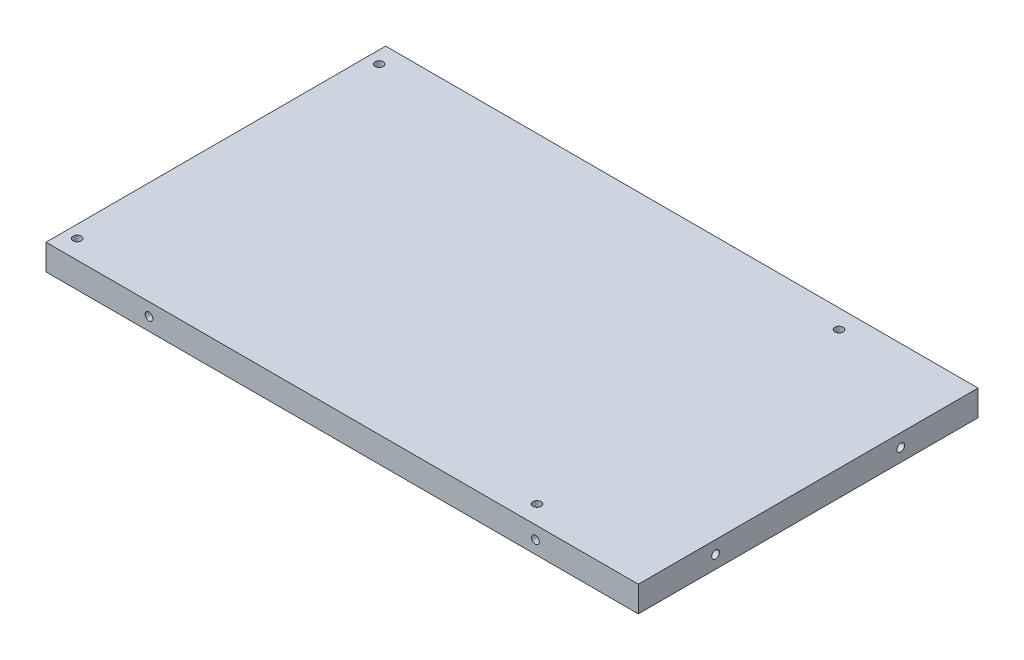
ISO-10303-21;
HEADER;
FILE_DESCRIPTION(('STEP AP214'),'2;1');
FILE_NAME('part.step','',(''),(''),'','','');
FILE_SCHEMA(('AUTOMOTIVE_DESIGN { 1 0 10303 214 1 1 1 1 }'));
ENDSEC;
DATA;
#1=APPLICATION_CONTEXT('core data for automotive mechanical design processes');
#2=APPLICATION_PROTOCOL_DEFINITION('international standard','automotive_design',2000,#1);
#3=PRODUCT_CONTEXT('',#1,'mechanical');
#4=PRODUCT('Part','Part','',(#3));
#5=PRODUCT_RELATED_PRODUCT_CATEGORY('part','',(#4));
#6=PRODUCT_DEFINITION_FORMATION('','',#4);
#7=PRODUCT_DEFINITION_CONTEXT('part definition',#1,'design');
#8=PRODUCT_DEFINITION('design','',#6,#7);
#9=PRODUCT_DEFINITION_SHAPE('','',#8);
#10=(LENGTH_UNIT() NAMED_UNIT(*) SI_UNIT(.MILLI.,.METRE.));
#11=(NAMED_UNIT(*) PLANE_ANGLE_UNIT() SI_UNIT($,.RADIAN.));
#12=(NAMED_UNIT(*) SI_UNIT($,.STERADIAN.) SOLID_ANGLE_UNIT());
#13=UNCERTAINTY_MEASURE_WITH_UNIT(LENGTH_MEASURE(1.E-05),#10,'distance_accuracy_value','');
#14=(GEOMETRIC_REPRESENTATION_CONTEXT(3) GLOBAL_UNCERTAINTY_ASSIGNED_CONTEXT((#13)) GLOBAL_UNIT_ASSIGNED_CONTEXT((#10,
#11,#12)) REPRESENTATION_CONTEXT('',''));
#15=CARTESIAN_POINT('',(0.,0.,0.));
#16=DIRECTION('',(0.,0.,1.));
#17=DIRECTION('',(1.,0.,0.));
#18=AXIS2_PLACEMENT_3D('',#15,#16,#17);
#19=CARTESIAN_POINT('',(0.,5.,0.));
#20=DIRECTION('',(0.,0.,-1.));
#21=DIRECTION('',(-1.,0.,0.));
#22=AXIS2_PLACEMENT_3D('',#19,#20,#21);
#23=PLANE('',#22);
#24=CARTESIAN_POINT('',(20.,2.5,0.));
#25=DIRECTION('',(0.,0.,-1.));
#26=DIRECTION('',(-1.,0.,0.));
#27=AXIS2_PLACEMENT_3D('',#24,#25,#26);
#28=CIRCLE('',#27,0.749999999999998);
#29=CARTESIAN_POINT('',(19.25,2.5,0.));
#30=VERTEX_POINT('',#29);
#31=EDGE_CURVE('E123',#30,#30,#28,.T.);
#32=ORIENTED_EDGE('',*,*,#31,.F.);
#33=EDGE_LOOP('',(#32));
#34=FACE_BOUND('',#33,.T.);
#35=CARTESIAN_POINT('',(95.1,2.5,0.));
#36=DIRECTION('',(0.,0.,-1.));
#37=DIRECTION('',(-1.,0.,0.));
#38=AXIS2_PLACEMENT_3D('',#35,#36,#37);
#39=CIRCLE('',#38,0.749999999999999);
#40=CARTESIAN_POINT('',(94.35,2.5,0.));
#41=VERTEX_POINT('',#40);
#42=EDGE_CURVE('E126',#41,#41,#39,.T.);
#43=ORIENTED_EDGE('',*,*,#42,.F.);
#44=EDGE_LOOP('',(#43));
#45=FACE_BOUND('',#44,.T.);
#46=DIRECTION('',(1.,0.,0.));
#47=VECTOR('',#46,1.);
#48=CARTESIAN_POINT('',(0.,0.,0.));
#49=LINE('',#48,#47);
#50=CARTESIAN_POINT('',(0.,0.,0.));
#51=VERTEX_POINT('',#50);
#52=CARTESIAN_POINT('',(115.1,0.,0.));
#53=VERTEX_POINT('',#52);
#54=EDGE_CURVE('E100',#51,#53,#49,.T.);
#55=ORIENTED_EDGE('',*,*,#54,.F.);
#56=DIRECTION('',(0.,-1.,0.));
#57=VECTOR('',#56,1.);
#58=CARTESIAN_POINT('',(0.,5.,0.));
#59=LINE('',#58,#57);
#60=CARTESIAN_POINT('',(0.,5.,0.));
#61=VERTEX_POINT('',#60);
#62=EDGE_CURVE('E11',#61,#51,#59,.T.);
#63=ORIENTED_EDGE('',*,*,#62,.F.);
#64=DIRECTION('',(1.,0.,0.));
#65=VECTOR('',#64,1.);
#66=CARTESIAN_POINT('',(0.,5.,0.));
#67=LINE('',#66,#65);
#68=CARTESIAN_POINT('',(115.1,5.,0.));
#69=VERTEX_POINT('',#68);
#70=EDGE_CURVE('E94',#61,#69,#67,.T.);
#71=ORIENTED_EDGE('',*,*,#70,.T.);
#72=DIRECTION('',(0.,-1.,0.));
#73=VECTOR('',#72,1.);
#74=CARTESIAN_POINT('',(115.1,5.,0.));
#75=LINE('',#74,#73);
#76=EDGE_CURVE('E37',#69,#53,#75,.T.);
#77=ORIENTED_EDGE('',*,*,#76,.T.);
#78=EDGE_LOOP('',(#55,#63,#71,#77));
#79=FACE_BOUND('',#78,.T.);
#80=ADVANCED_FACE('F34',(#34,#45,#79),#23,.T.);
#81=CARTESIAN_POINT('',(0.,5.,0.));
#82=DIRECTION('',(1.,0.,0.));
#83=DIRECTION('',(0.,0.,-1.));
#84=AXIS2_PLACEMENT_3D('',#81,#82,#83);
#85=PLANE('',#84);
#86=CARTESIAN_POINT('',(0.,2.5,15.));
#87=DIRECTION('',(-1.,0.,0.));
#88=DIRECTION('',(0.,0.,1.));
#89=AXIS2_PLACEMENT_3D('',#86,#87,#88);
#90=CIRCLE('',#89,0.749999999999998);
#91=CARTESIAN_POINT('',(0.,2.5,15.75));
#92=VERTEX_POINT('',#91);
#93=EDGE_CURVE('E168',#92,#92,#90,.T.);
#94=ORIENTED_EDGE('',*,*,#93,.F.);
#95=EDGE_LOOP('',(#94));
#96=FACE_BOUND('',#95,.T.);
#97=CARTESIAN_POINT('',(0.,2.5,51.));
#98=DIRECTION('',(-1.,0.,0.));
#99=DIRECTION('',(0.,0.,1.));
#100=AXIS2_PLACEMENT_3D('',#97,#98,#99);
#101=CIRCLE('',#100,0.749999999999999);
#102=CARTESIAN_POINT('',(0.,2.5,51.75));
#103=VERTEX_POINT('',#102);
#104=EDGE_CURVE('E171',#103,#103,#101,.T.);
#105=ORIENTED_EDGE('',*,*,#104,.F.);
#106=EDGE_LOOP('',(#105));
#107=FACE_BOUND('',#106,.T.);
#108=DIRECTION('',(0.,0.,1.));
#109=VECTOR('',#108,1.);
#110=CARTESIAN_POINT('',(0.,0.,0.));
#111=LINE('',#110,#109);
#112=CARTESIAN_POINT('',(0.,0.,66.));
#113=VERTEX_POINT('',#112);
#114=EDGE_CURVE('E67',#51,#113,#111,.T.);
#115=ORIENTED_EDGE('',*,*,#114,.T.);
#116=DIRECTION('',(0.,-1.,0.));
#117=VECTOR('',#116,1.);
#118=CARTESIAN_POINT('',(0.,5.,66.));
#119=LINE('',#118,#117);
#120=CARTESIAN_POINT('',(0.,5.,66.));
#121=VERTEX_POINT('',#120);
#122=EDGE_CURVE('E43',#121,#113,#119,.T.);
#123=ORIENTED_EDGE('',*,*,#122,.F.);
#124=DIRECTION('',(0.,0.,1.));
#125=VECTOR('',#124,1.);
#126=CARTESIAN_POINT('',(0.,5.,0.));
#127=LINE('',#126,#125);
#128=EDGE_CURVE('E84',#61,#121,#127,.T.);
#129=ORIENTED_EDGE('',*,*,#128,.F.);
#130=ORIENTED_EDGE('',*,*,#62,.T.);
#131=EDGE_LOOP('',(#115,#123,#129,#130));
#132=FACE_BOUND('',#131,.T.);
#133=ADVANCED_FACE('F111',(#96,#107,#132),#85,.F.);
#134=CARTESIAN_POINT('',(0.,5.,66.));
#135=DIRECTION('',(0.,0.,-1.));
#136=DIRECTION('',(-1.,0.,0.));
#137=AXIS2_PLACEMENT_3D('',#134,#135,#136);
#138=PLANE('',#137);
#139=CARTESIAN_POINT('',(20.,2.5,66.));
#140=DIRECTION('',(0.,0.,1.));
#141=DIRECTION('',(1.,0.,0.));
#142=AXIS2_PLACEMENT_3D('',#139,#140,#141);
#143=CIRCLE('',#142,0.749999999999998);
#144=CARTESIAN_POINT('',(20.75,2.5,66.));
#145=VERTEX_POINT('',#144);
#146=EDGE_CURVE('E142',#145,#145,#143,.T.);
#147=ORIENTED_EDGE('',*,*,#146,.F.);
#148=EDGE_LOOP('',(#147));
#149=FACE_BOUND('',#148,.T.);
#150=CARTESIAN_POINT('',(95.1,2.5,66.));
#151=DIRECTION('',(0.,0.,1.));
#152=DIRECTION('',(1.,0.,0.));
#153=AXIS2_PLACEMENT_3D('',#150,#151,#152);
#154=CIRCLE('',#153,0.749999999999999);
#155=CARTESIAN_POINT('',(95.85,2.5,66.));
#156=VERTEX_POINT('',#155);
#157=EDGE_CURVE('E148',#156,#156,#154,.T.);
#158=ORIENTED_EDGE('',*,*,#157,.F.);
#159=EDGE_LOOP('',(#158));
#160=FACE_BOUND('',#159,.T.);
#161=DIRECTION('',(1.,0.,0.));
#162=VECTOR('',#161,1.);
#163=CARTESIAN_POINT('',(0.,0.,66.));
#164=LINE('',#163,#162);
#165=CARTESIAN_POINT('',(115.1,0.,66.));
#166=VERTEX_POINT('',#165);
#167=EDGE_CURVE('E91',#113,#166,#164,.T.);
#168=ORIENTED_EDGE('',*,*,#167,.T.);
#169=DIRECTION('',(0.,-1.,0.));
#170=VECTOR('',#169,1.);
#171=CARTESIAN_POINT('',(115.1,5.,66.));
#172=LINE('',#171,#170);
#173=CARTESIAN_POINT('',(115.1,5.,66.));
#174=VERTEX_POINT('',#173);
#175=EDGE_CURVE('E88',#174,#166,#172,.T.);
#176=ORIENTED_EDGE('',*,*,#175,.F.);
#177=DIRECTION('',(1.,0.,0.));
#178=VECTOR('',#177,1.);
#179=CARTESIAN_POINT('',(0.,5.,66.));
#180=LINE('',#179,#178);
#181=EDGE_CURVE('E79',#121,#174,#180,.T.);
#182=ORIENTED_EDGE('',*,*,#181,.F.);
#183=ORIENTED_EDGE('',*,*,#122,.T.);
#184=EDGE_LOOP('',(#168,#176,#182,#183));
#185=FACE_BOUND('',#184,.T.);
#186=ADVANCED_FACE('F89',(#149,#160,#185),#138,.F.);
#187=CARTESIAN_POINT('',(115.1,5.,0.));
#188=DIRECTION('',(1.,0.,0.));
#189=DIRECTION('',(0.,0.,-1.));
#190=AXIS2_PLACEMENT_3D('',#187,#188,#189);
#191=PLANE('',#190);
#192=CARTESIAN_POINT('',(115.1,2.5,51.));
#193=DIRECTION('',(1.,0.,0.));
#194=DIRECTION('',(0.,0.,-1.));
#195=AXIS2_PLACEMENT_3D('',#192,#193,#194);
#196=CIRCLE('',#195,0.749999999999999);
#197=CARTESIAN_POINT('',(115.1,2.5,50.25));
#198=VERTEX_POINT('',#197);
#199=EDGE_CURVE('E156',#198,#198,#196,.T.);
#200=ORIENTED_EDGE('',*,*,#199,.F.);
#201=EDGE_LOOP('',(#200));
#202=FACE_BOUND('',#201,.T.);
#203=CARTESIAN_POINT('',(115.1,2.5,15.));
#204=DIRECTION('',(1.,0.,0.));
#205=DIRECTION('',(0.,0.,-1.));
#206=AXIS2_PLACEMENT_3D('',#203,#204,#205);
#207=CIRCLE('',#206,0.749999999999998);
#208=CARTESIAN_POINT('',(115.1,2.5,14.25));
#209=VERTEX_POINT('',#208);
#210=EDGE_CURVE('E141',#209,#209,#207,.T.);
#211=ORIENTED_EDGE('',*,*,#210,.F.);
#212=EDGE_LOOP('',(#211));
#213=FACE_BOUND('',#212,.T.);
#214=DIRECTION('',(0.,0.,1.));
#215=VECTOR('',#214,1.);
#216=CARTESIAN_POINT('',(115.1,0.,0.));
#217=LINE('',#216,#215);
#218=EDGE_CURVE('E103',#53,#166,#217,.T.);
#219=ORIENTED_EDGE('',*,*,#218,.F.);
#220=ORIENTED_EDGE('',*,*,#76,.F.);
#221=DIRECTION('',(0.,0.,1.));
#222=VECTOR('',#221,1.);
#223=CARTESIAN_POINT('',(115.1,5.,0.));
#224=LINE('',#223,#222);
#225=EDGE_CURVE('E83',#69,#174,#224,.T.);
#226=ORIENTED_EDGE('',*,*,#225,.T.);
#227=ORIENTED_EDGE('',*,*,#175,.T.);
#228=EDGE_LOOP('',(#219,#220,#226,#227));
#229=FACE_BOUND('',#228,.T.);
#230=ADVANCED_FACE('F93',(#202,#213,#229),#191,.T.);
#231=CARTESIAN_POINT('',(0.,5.,0.));
#232=DIRECTION('',(0.,-1.,0.));
#233=DIRECTION('',(0.,0.,-1.));
#234=AXIS2_PLACEMENT_3D('',#231,#232,#233);
#235=PLANE('',#234);
#236=CARTESIAN_POINT('',(91.7499999999988,5.,3.65647481694185));
#237=DIRECTION('',(0.,1.,0.));
#238=DIRECTION('',(0.,0.,1.));
#239=AXIS2_PLACEMENT_3D('',#236,#237,#238);
#240=CIRCLE('',#239,0.799999999999995);
#241=CARTESIAN_POINT('',(91.7499999999988,5.,4.45647481694184));
#242=VERTEX_POINT('',#241);
#243=EDGE_CURVE('E182',#242,#242,#240,.T.);
#244=ORIENTED_EDGE('',*,*,#243,.F.);
#245=EDGE_LOOP('',(#244));
#246=FACE_BOUND('',#245,.T.);
#247=CARTESIAN_POINT('',(2.39999999999885,5.,62.3499962310792));
#248=DIRECTION('',(0.,1.,0.));
#249=DIRECTION('',(0.,0.,1.));
#250=AXIS2_PLACEMENT_3D('',#247,#248,#249);
#251=CIRCLE('',#250,0.800000000000005);
#252=CARTESIAN_POINT('',(2.39999999999885,5.,63.1499962310792));
#253=VERTEX_POINT('',#252);
#254=EDGE_CURVE('E189',#253,#253,#251,.T.);
#255=ORIENTED_EDGE('',*,*,#254,.F.);
#256=EDGE_LOOP('',(#255));
#257=FACE_BOUND('',#256,.T.);
#258=CARTESIAN_POINT('',(2.39999999999885,5.,3.65647481694185));
#259=DIRECTION('',(0.,1.,0.));
#260=DIRECTION('',(0.,0.,1.));
#261=AXIS2_PLACEMENT_3D('',#258,#259,#260);
#262=CIRCLE('',#261,0.799999999999999);
#263=CARTESIAN_POINT('',(2.39999999999885,5.,4.45647481694185));
#264=VERTEX_POINT('',#263);
#265=EDGE_CURVE('E176',#264,#264,#262,.T.);
#266=ORIENTED_EDGE('',*,*,#265,.F.);
#267=EDGE_LOOP('',(#266));
#268=FACE_BOUND('',#267,.T.);
#269=CARTESIAN_POINT('',(91.7499999999988,5.,62.3499962310792));
#270=DIRECTION('',(0.,1.,0.));
#271=DIRECTION('',(0.,0.,1.));
#272=AXIS2_PLACEMENT_3D('',#269,#270,#271);
#273=CIRCLE('',#272,0.80000000000001);
#274=CARTESIAN_POINT('',(91.7499999999988,5.,63.1499962310792));
#275=VERTEX_POINT('',#274);
#276=EDGE_CURVE('E185',#275,#275,#273,.T.);
#277=ORIENTED_EDGE('',*,*,#276,.F.);
#278=EDGE_LOOP('',(#277));
#279=FACE_BOUND('',#278,.T.);
#280=ORIENTED_EDGE('',*,*,#70,.F.);
#281=ORIENTED_EDGE('',*,*,#128,.T.);
#282=ORIENTED_EDGE('',*,*,#181,.T.);
#283=ORIENTED_EDGE('',*,*,#225,.F.);
#284=EDGE_LOOP('',(#280,#281,#282,#283));
#285=FACE_BOUND('',#284,.T.);
#286=ADVANCED_FACE('F82',(#246,#257,#268,#279,#285),#235,.F.);
#287=CARTESIAN_POINT('',(0.,0.,0.));
#288=DIRECTION('',(0.,-1.,0.));
#289=DIRECTION('',(0.,0.,-1.));
#290=AXIS2_PLACEMENT_3D('',#287,#288,#289);
#291=PLANE('',#290);
#292=CARTESIAN_POINT('',(72.6,0.,8.8));
#293=DIRECTION('',(0.,-1.,0.));
#294=DIRECTION('',(0.,0.,-1.));
#295=AXIS2_PLACEMENT_3D('',#292,#293,#294);
#296=CIRCLE('',#295,0.749999999999999);
#297=CARTESIAN_POINT('',(72.6,0.,8.05));
#298=VERTEX_POINT('',#297);
#299=EDGE_CURVE('E584',#298,#298,#296,.T.);
#300=ORIENTED_EDGE('',*,*,#299,.F.);
#301=EDGE_LOOP('',(#300));
#302=FACE_BOUND('',#301,.T.);
#303=CARTESIAN_POINT('',(42.5,0.,8.8));
#304=DIRECTION('',(0.,-1.,0.));
#305=DIRECTION('',(0.,0.,-1.));
#306=AXIS2_PLACEMENT_3D('',#303,#304,#305);
#307=CIRCLE('',#306,0.749999999999999);
#308=CARTESIAN_POINT('',(42.5,0.,8.05));
#309=VERTEX_POINT('',#308);
#310=EDGE_CURVE('E590',#309,#309,#307,.T.);
#311=ORIENTED_EDGE('',*,*,#310,.F.);
#312=EDGE_LOOP('',(#311));
#313=FACE_BOUND('',#312,.T.);
#314=CARTESIAN_POINT('',(42.5,0.,57.2));
#315=DIRECTION('',(0.,-1.,0.));
#316=DIRECTION('',(0.,0.,-1.));
#317=AXIS2_PLACEMENT_3D('',#314,#315,#316);
#318=CIRCLE('',#317,0.749999999999999);
#319=CARTESIAN_POINT('',(42.5,0.,56.45));
#320=VERTEX_POINT('',#319);
#321=EDGE_CURVE('E580',#320,#320,#318,.T.);
#322=ORIENTED_EDGE('',*,*,#321,.F.);
#323=EDGE_LOOP('',(#322));
#324=FACE_BOUND('',#323,.T.);
#325=CARTESIAN_POINT('',(72.6,0.,57.2));
#326=DIRECTION('',(0.,-1.,0.));
#327=DIRECTION('',(0.,0.,-1.));
#328=AXIS2_PLACEMENT_3D('',#325,#326,#327);
#329=CIRCLE('',#328,0.749999999999999);
#330=CARTESIAN_POINT('',(72.6,0.,56.45));
#331=VERTEX_POINT('',#330);
#332=EDGE_CURVE('E134',#331,#331,#329,.T.);
#333=ORIENTED_EDGE('',*,*,#332,.F.);
#334=EDGE_LOOP('',(#333));
#335=FACE_BOUND('',#334,.T.);
#336=ORIENTED_EDGE('',*,*,#54,.T.);
#337=ORIENTED_EDGE('',*,*,#218,.T.);
#338=ORIENTED_EDGE('',*,*,#167,.F.);
#339=ORIENTED_EDGE('',*,*,#114,.F.);
#340=EDGE_LOOP('',(#336,#337,#338,#339));
#341=FACE_BOUND('',#340,.T.);
#342=ADVANCED_FACE('F109',(#302,#313,#324,#335,#341),#291,.T.);
#343=CARTESIAN_POINT('',(91.7499999999988,2.,62.3499962310792));
#344=DIRECTION('',(0.,1.,0.));
#345=DIRECTION('',(0.,0.,1.));
#346=AXIS2_PLACEMENT_3D('',#343,#344,#345);
#347=CYLINDRICAL_SURFACE('',#346,0.80000000000001);
#348=CARTESIAN_POINT('',(91.7499999999988,2.,62.3499962310792));
#349=DIRECTION('',(0.,1.,0.));
#350=DIRECTION('',(0.,0.,1.));
#351=AXIS2_PLACEMENT_3D('',#348,#349,#350);
#352=CIRCLE('',#351,0.80000000000001);
#353=CARTESIAN_POINT('',(91.7499999999988,2.,63.1499962310792));
#354=VERTEX_POINT('',#353);
#355=EDGE_CURVE('E104',#354,#354,#352,.T.);
#356=ORIENTED_EDGE('',*,*,#355,.F.);
#357=EDGE_LOOP('',(#356));
#358=FACE_BOUND('',#357,.T.);
#359=ORIENTED_EDGE('',*,*,#276,.T.);
#360=EDGE_LOOP('',(#359));
#361=FACE_BOUND('',#360,.T.);
#362=ADVANCED_FACE('F198',(#358,#361),#347,.F.);
#363=CARTESIAN_POINT('',(91.7499999999988,2.,62.3499962310792));
#364=DIRECTION('',(0.,1.,0.));
#365=DIRECTION('',(0.,0.,1.));
#366=AXIS2_PLACEMENT_3D('',#363,#364,#365);
#367=PLANE('',#366);
#368=ORIENTED_EDGE('',*,*,#355,.T.);
#369=EDGE_LOOP('',(#368));
#370=FACE_BOUND('',#369,.T.);
#371=ADVANCED_FACE('F277',(#370),#367,.T.);
#372=CARTESIAN_POINT('',(2.39999999999885,2.,3.65647481694185));
#373=DIRECTION('',(0.,1.,0.));
#374=DIRECTION('',(0.,0.,1.));
#375=AXIS2_PLACEMENT_3D('',#372,#373,#374);
#376=CYLINDRICAL_SURFACE('',#375,0.799999999999999);
#377=CARTESIAN_POINT('',(2.39999999999885,2.,3.65647481694185));
#378=DIRECTION('',(0.,1.,0.));
#379=DIRECTION('',(0.,0.,1.));
#380=AXIS2_PLACEMENT_3D('',#377,#378,#379);
#381=CIRCLE('',#380,0.799999999999999);
#382=CARTESIAN_POINT('',(2.39999999999885,2.,4.45647481694185));
#383=VERTEX_POINT('',#382);
#384=EDGE_CURVE('E167',#383,#383,#381,.T.);
#385=ORIENTED_EDGE('',*,*,#384,.F.);
#386=EDGE_LOOP('',(#385));
#387=FACE_BOUND('',#386,.T.);
#388=ORIENTED_EDGE('',*,*,#265,.T.);
#389=EDGE_LOOP('',(#388));
#390=FACE_BOUND('',#389,.T.);
#391=ADVANCED_FACE('F273',(#387,#390),#376,.F.);
#392=CARTESIAN_POINT('',(2.39999999999885,2.,3.65647481694185));
#393=DIRECTION('',(0.,1.,0.));
#394=DIRECTION('',(0.,0.,1.));
#395=AXIS2_PLACEMENT_3D('',#392,#393,#394);
#396=PLANE('',#395);
#397=ORIENTED_EDGE('',*,*,#384,.T.);
#398=EDGE_LOOP('',(#397));
#399=FACE_BOUND('',#398,.T.);
#400=ADVANCED_FACE('F276',(#399),#396,.T.);
#401=CARTESIAN_POINT('',(2.39999999999885,2.,62.3499962310792));
#402=DIRECTION('',(0.,1.,0.));
#403=DIRECTION('',(0.,0.,1.));
#404=AXIS2_PLACEMENT_3D('',#401,#402,#403);
#405=CYLINDRICAL_SURFACE('',#404,0.800000000000005);
#406=CARTESIAN_POINT('',(2.39999999999885,2.,62.3499962310792));
#407=DIRECTION('',(0.,1.,0.));
#408=DIRECTION('',(0.,0.,1.));
#409=AXIS2_PLACEMENT_3D('',#406,#407,#408);
#410=CIRCLE('',#409,0.800000000000005);
#411=CARTESIAN_POINT('',(2.39999999999885,2.,63.1499962310792));
#412=VERTEX_POINT('',#411);
#413=EDGE_CURVE('E179',#412,#412,#410,.T.);
#414=ORIENTED_EDGE('',*,*,#413,.F.);
#415=EDGE_LOOP('',(#414));
#416=FACE_BOUND('',#415,.T.);
#417=ORIENTED_EDGE('',*,*,#254,.T.);
#418=EDGE_LOOP('',(#417));
#419=FACE_BOUND('',#418,.T.);
#420=ADVANCED_FACE('F281',(#416,#419),#405,.F.);
#421=CARTESIAN_POINT('',(2.39999999999885,2.,62.3499962310792));
#422=DIRECTION('',(0.,1.,0.));
#423=DIRECTION('',(0.,0.,1.));
#424=AXIS2_PLACEMENT_3D('',#421,#422,#423);
#425=PLANE('',#424);
#426=ORIENTED_EDGE('',*,*,#413,.T.);
#427=EDGE_LOOP('',(#426));
#428=FACE_BOUND('',#427,.T.);
#429=ADVANCED_FACE('F286',(#428),#425,.T.);
#430=CARTESIAN_POINT('',(91.7499999999988,2.,3.65647481694185));
#431=DIRECTION('',(0.,1.,0.));
#432=DIRECTION('',(0.,0.,1.));
#433=AXIS2_PLACEMENT_3D('',#430,#431,#432);
#434=CYLINDRICAL_SURFACE('',#433,0.799999999999995);
#435=CARTESIAN_POINT('',(91.7499999999988,2.,3.65647481694185));
#436=DIRECTION('',(0.,1.,0.));
#437=DIRECTION('',(0.,0.,1.));
#438=AXIS2_PLACEMENT_3D('',#435,#436,#437);
#439=CIRCLE('',#438,0.799999999999995);
#440=CARTESIAN_POINT('',(91.7499999999988,2.,4.45647481694184));
#441=VERTEX_POINT('',#440);
#442=EDGE_CURVE('E186',#441,#441,#439,.T.);
#443=ORIENTED_EDGE('',*,*,#442,.F.);
#444=EDGE_LOOP('',(#443));
#445=FACE_BOUND('',#444,.T.);
#446=ORIENTED_EDGE('',*,*,#243,.T.);
#447=EDGE_LOOP('',(#446));
#448=FACE_BOUND('',#447,.T.);
#449=ADVANCED_FACE('F283',(#445,#448),#434,.F.);
#450=CARTESIAN_POINT('',(91.7499999999988,2.,3.65647481694185));
#451=DIRECTION('',(0.,1.,0.));
#452=DIRECTION('',(0.,0.,1.));
#453=AXIS2_PLACEMENT_3D('',#450,#451,#452);
#454=PLANE('',#453);
#455=ORIENTED_EDGE('',*,*,#442,.T.);
#456=EDGE_LOOP('',(#455));
#457=FACE_BOUND('',#456,.T.);
#458=ADVANCED_FACE('F268',(#457),#454,.T.);
#459=CARTESIAN_POINT('',(3.99999999999999,2.5,51.));
#460=DIRECTION('',(-1.,0.,0.));
#461=DIRECTION('',(0.,0.,1.));
#462=AXIS2_PLACEMENT_3D('',#459,#460,#461);
#463=CYLINDRICAL_SURFACE('',#462,0.749999999999999);
#464=CARTESIAN_POINT('',(3.99999999999999,2.5,51.));
#465=DIRECTION('',(-1.,0.,0.));
#466=DIRECTION('',(0.,0.,1.));
#467=AXIS2_PLACEMENT_3D('',#464,#465,#466);
#468=CIRCLE('',#467,0.749999999999999);
#469=CARTESIAN_POINT('',(3.99999999999999,2.5,51.75));
#470=VERTEX_POINT('',#469);
#471=EDGE_CURVE('E155',#470,#470,#468,.T.);
#472=ORIENTED_EDGE('',*,*,#471,.F.);
#473=EDGE_LOOP('',(#472));
#474=FACE_BOUND('',#473,.T.);
#475=ORIENTED_EDGE('',*,*,#104,.T.);
#476=EDGE_LOOP('',(#475));
#477=FACE_BOUND('',#476,.T.);
#478=ADVANCED_FACE('F265',(#474,#477),#463,.F.);
#479=CARTESIAN_POINT('',(3.99999999999999,2.5,51.));
#480=DIRECTION('',(-1.,0.,0.));
#481=DIRECTION('',(0.,0.,1.));
#482=AXIS2_PLACEMENT_3D('',#479,#480,#481);
#483=PLANE('',#482);
#484=ORIENTED_EDGE('',*,*,#471,.T.);
#485=EDGE_LOOP('',(#484));
#486=FACE_BOUND('',#485,.T.);
#487=ADVANCED_FACE('F263',(#486),#483,.T.);
#488=CARTESIAN_POINT('',(4.,2.5,15.));
#489=DIRECTION('',(-1.,0.,0.));
#490=DIRECTION('',(0.,0.,1.));
#491=AXIS2_PLACEMENT_3D('',#488,#489,#490);
#492=CYLINDRICAL_SURFACE('',#491,0.749999999999998);
#493=CARTESIAN_POINT('',(4.,2.5,15.));
#494=DIRECTION('',(-1.,0.,0.));
#495=DIRECTION('',(0.,0.,1.));
#496=AXIS2_PLACEMENT_3D('',#493,#494,#495);
#497=CIRCLE('',#496,0.749999999999998);
#498=CARTESIAN_POINT('',(4.,2.5,15.75));
#499=VERTEX_POINT('',#498);
#500=EDGE_CURVE('E164',#499,#499,#497,.T.);
#501=ORIENTED_EDGE('',*,*,#500,.F.);
#502=EDGE_LOOP('',(#501));
#503=FACE_BOUND('',#502,.T.);
#504=ORIENTED_EDGE('',*,*,#93,.T.);
#505=EDGE_LOOP('',(#504));
#506=FACE_BOUND('',#505,.T.);
#507=ADVANCED_FACE('F259',(#503,#506),#492,.F.);
#508=CARTESIAN_POINT('',(4.,2.5,15.));
#509=DIRECTION('',(-1.,0.,0.));
#510=DIRECTION('',(0.,0.,1.));
#511=AXIS2_PLACEMENT_3D('',#508,#509,#510);
#512=PLANE('',#511);
#513=ORIENTED_EDGE('',*,*,#500,.T.);
#514=EDGE_LOOP('',(#513));
#515=FACE_BOUND('',#514,.T.);
#516=ADVANCED_FACE('F255',(#515),#512,.T.);
#517=CARTESIAN_POINT('',(111.1,2.5,15.));
#518=DIRECTION('',(1.,0.,0.));
#519=DIRECTION('',(0.,0.,-1.));
#520=AXIS2_PLACEMENT_3D('',#517,#518,#519);
#521=CYLINDRICAL_SURFACE('',#520,0.749999999999998);
#522=CARTESIAN_POINT('',(111.1,2.5,15.));
#523=DIRECTION('',(1.,0.,0.));
#524=DIRECTION('',(0.,0.,-1.));
#525=AXIS2_PLACEMENT_3D('',#522,#523,#524);
#526=CIRCLE('',#525,0.749999999999998);
#527=CARTESIAN_POINT('',(111.1,2.5,14.25));
#528=VERTEX_POINT('',#527);
#529=EDGE_CURVE('E159',#528,#528,#526,.T.);
#530=ORIENTED_EDGE('',*,*,#529,.F.);
#531=EDGE_LOOP('',(#530));
#532=FACE_BOUND('',#531,.T.);
#533=ORIENTED_EDGE('',*,*,#210,.T.);
#534=EDGE_LOOP('',(#533));
#535=FACE_BOUND('',#534,.T.);
#536=ADVANCED_FACE('F251',(#532,#535),#521,.F.);
#537=CARTESIAN_POINT('',(111.1,2.5,15.));
#538=DIRECTION('',(1.,0.,0.));
#539=DIRECTION('',(0.,0.,-1.));
#540=AXIS2_PLACEMENT_3D('',#537,#538,#539);
#541=PLANE('',#540);
#542=ORIENTED_EDGE('',*,*,#529,.T.);
#543=EDGE_LOOP('',(#542));
#544=FACE_BOUND('',#543,.T.);
#545=ADVANCED_FACE('F247',(#544),#541,.T.);
#546=CARTESIAN_POINT('',(111.1,2.5,51.));
#547=DIRECTION('',(1.,0.,0.));
#548=DIRECTION('',(0.,0.,-1.));
#549=AXIS2_PLACEMENT_3D('',#546,#547,#548);
#550=CYLINDRICAL_SURFACE('',#549,0.749999999999999);
#551=CARTESIAN_POINT('',(111.1,2.5,51.));
#552=DIRECTION('',(1.,0.,0.));
#553=DIRECTION('',(0.,0.,-1.));
#554=AXIS2_PLACEMENT_3D('',#551,#552,#553);
#555=CIRCLE('',#554,0.749999999999999);
#556=CARTESIAN_POINT('',(111.1,2.5,50.25));
#557=VERTEX_POINT('',#556);
#558=EDGE_CURVE('E152',#557,#557,#555,.T.);
#559=ORIENTED_EDGE('',*,*,#558,.F.);
#560=EDGE_LOOP('',(#559));
#561=FACE_BOUND('',#560,.T.);
#562=ORIENTED_EDGE('',*,*,#199,.T.);
#563=EDGE_LOOP('',(#562));
#564=FACE_BOUND('',#563,.T.);
#565=ADVANCED_FACE('F239',(#561,#564),#550,.F.);
#566=CARTESIAN_POINT('',(111.1,2.5,51.));
#567=DIRECTION('',(1.,0.,0.));
#568=DIRECTION('',(0.,0.,-1.));
#569=AXIS2_PLACEMENT_3D('',#566,#567,#568);
#570=PLANE('',#569);
#571=ORIENTED_EDGE('',*,*,#558,.T.);
#572=EDGE_LOOP('',(#571));
#573=FACE_BOUND('',#572,.T.);
#574=ADVANCED_FACE('F230',(#573),#570,.T.);
#575=CARTESIAN_POINT('',(95.1,2.5,62.));
#576=DIRECTION('',(0.,0.,1.));
#577=DIRECTION('',(1.,0.,0.));
#578=AXIS2_PLACEMENT_3D('',#575,#576,#577);
#579=CYLINDRICAL_SURFACE('',#578,0.749999999999999);
#580=CARTESIAN_POINT('',(95.1,2.5,62.));
#581=DIRECTION('',(0.,0.,1.));
#582=DIRECTION('',(1.,0.,0.));
#583=AXIS2_PLACEMENT_3D('',#580,#581,#582);
#584=CIRCLE('',#583,0.749999999999999);
#585=CARTESIAN_POINT('',(95.85,2.5,62.));
#586=VERTEX_POINT('',#585);
#587=EDGE_CURVE('E145',#586,#586,#584,.T.);
#588=ORIENTED_EDGE('',*,*,#587,.F.);
#589=EDGE_LOOP('',(#588));
#590=FACE_BOUND('',#589,.T.);
#591=ORIENTED_EDGE('',*,*,#157,.T.);
#592=EDGE_LOOP('',(#591));
#593=FACE_BOUND('',#592,.T.);
#594=ADVANCED_FACE('F227',(#590,#593),#579,.F.);
#595=CARTESIAN_POINT('',(95.1,2.5,62.));
#596=DIRECTION('',(0.,0.,1.));
#597=DIRECTION('',(1.,0.,0.));
#598=AXIS2_PLACEMENT_3D('',#595,#596,#597);
#599=PLANE('',#598);
#600=ORIENTED_EDGE('',*,*,#587,.T.);
#601=EDGE_LOOP('',(#600));
#602=FACE_BOUND('',#601,.T.);
#603=ADVANCED_FACE('F229',(#602),#599,.T.);
#604=CARTESIAN_POINT('',(20.,2.5,62.));
#605=DIRECTION('',(0.,0.,1.));
#606=DIRECTION('',(1.,0.,0.));
#607=AXIS2_PLACEMENT_3D('',#604,#605,#606);
#608=CYLINDRICAL_SURFACE('',#607,0.749999999999998);
#609=CARTESIAN_POINT('',(20.,2.5,62.));
#610=DIRECTION('',(0.,0.,1.));
#611=DIRECTION('',(1.,0.,0.));
#612=AXIS2_PLACEMENT_3D('',#609,#610,#611);
#613=CIRCLE('',#612,0.749999999999998);
#614=CARTESIAN_POINT('',(20.75,2.5,62.));
#615=VERTEX_POINT('',#614);
#616=EDGE_CURVE('E138',#615,#615,#613,.T.);
#617=ORIENTED_EDGE('',*,*,#616,.F.);
#618=EDGE_LOOP('',(#617));
#619=FACE_BOUND('',#618,.T.);
#620=ORIENTED_EDGE('',*,*,#146,.T.);
#621=EDGE_LOOP('',(#620));
#622=FACE_BOUND('',#621,.T.);
#623=ADVANCED_FACE('F236',(#619,#622),#608,.F.);
#624=CARTESIAN_POINT('',(20.,2.5,62.));
#625=DIRECTION('',(0.,0.,1.));
#626=DIRECTION('',(1.,0.,0.));
#627=AXIS2_PLACEMENT_3D('',#624,#625,#626);
#628=PLANE('',#627);
#629=ORIENTED_EDGE('',*,*,#616,.T.);
#630=EDGE_LOOP('',(#629));
#631=FACE_BOUND('',#630,.T.);
#632=ADVANCED_FACE('F414',(#631),#628,.T.);
#633=CARTESIAN_POINT('',(95.1,2.5,4.));
#634=DIRECTION('',(0.,0.,-1.));
#635=DIRECTION('',(-1.,0.,0.));
#636=AXIS2_PLACEMENT_3D('',#633,#634,#635);
#637=CYLINDRICAL_SURFACE('',#636,0.749999999999999);
#638=CARTESIAN_POINT('',(95.1,2.5,4.));
#639=DIRECTION('',(0.,0.,-1.));
#640=DIRECTION('',(-1.,0.,0.));
#641=AXIS2_PLACEMENT_3D('',#638,#639,#640);
#642=CIRCLE('',#641,0.749999999999999);
#643=CARTESIAN_POINT('',(94.35,2.5,4.));
#644=VERTEX_POINT('',#643);
#645=EDGE_CURVE('E128',#644,#644,#642,.T.);
#646=ORIENTED_EDGE('',*,*,#645,.F.);
#647=EDGE_LOOP('',(#646));
#648=FACE_BOUND('',#647,.T.);
#649=ORIENTED_EDGE('',*,*,#42,.T.);
#650=EDGE_LOOP('',(#649));
#651=FACE_BOUND('',#650,.T.);
#652=ADVANCED_FACE('F410',(#648,#651),#637,.F.);
#653=CARTESIAN_POINT('',(95.1,2.5,4.));
#654=DIRECTION('',(0.,0.,-1.));
#655=DIRECTION('',(-1.,0.,0.));
#656=AXIS2_PLACEMENT_3D('',#653,#654,#655);
#657=PLANE('',#656);
#658=ORIENTED_EDGE('',*,*,#645,.T.);
#659=EDGE_LOOP('',(#658));
#660=FACE_BOUND('',#659,.T.);
#661=ADVANCED_FACE('F406',(#660),#657,.T.);
#662=CARTESIAN_POINT('',(20.,2.5,4.));
#663=DIRECTION('',(0.,0.,-1.));
#664=DIRECTION('',(-1.,0.,0.));
#665=AXIS2_PLACEMENT_3D('',#662,#663,#664);
#666=CYLINDRICAL_SURFACE('',#665,0.749999999999998);
#667=CARTESIAN_POINT('',(20.,2.5,4.));
#668=DIRECTION('',(0.,0.,-1.));
#669=DIRECTION('',(-1.,0.,0.));
#670=AXIS2_PLACEMENT_3D('',#667,#668,#669);
#671=CIRCLE('',#670,0.749999999999998);
#672=CARTESIAN_POINT('',(19.25,2.5,4.));
#673=VERTEX_POINT('',#672);
#674=EDGE_CURVE('E151',#673,#673,#671,.T.);
#675=ORIENTED_EDGE('',*,*,#674,.F.);
#676=EDGE_LOOP('',(#675));
#677=FACE_BOUND('',#676,.T.);
#678=ORIENTED_EDGE('',*,*,#31,.T.);
#679=EDGE_LOOP('',(#678));
#680=FACE_BOUND('',#679,.T.);
#681=ADVANCED_FACE('F402',(#677,#680),#666,.F.);
#682=CARTESIAN_POINT('',(20.,2.5,4.));
#683=DIRECTION('',(0.,0.,-1.));
#684=DIRECTION('',(-1.,0.,0.));
#685=AXIS2_PLACEMENT_3D('',#682,#683,#684);
#686=PLANE('',#685);
#687=ORIENTED_EDGE('',*,*,#674,.T.);
#688=EDGE_LOOP('',(#687));
#689=FACE_BOUND('',#688,.T.);
#690=ADVANCED_FACE('F315',(#689),#686,.T.);
#691=CARTESIAN_POINT('',(72.6,3.,57.2));
#692=DIRECTION('',(0.,-1.,0.));
#693=DIRECTION('',(0.,0.,-1.));
#694=AXIS2_PLACEMENT_3D('',#691,#692,#693);
#695=CYLINDRICAL_SURFACE('',#694,0.749999999999999);
#696=CARTESIAN_POINT('',(72.6,3.,57.2));
#697=DIRECTION('',(0.,-1.,0.));
#698=DIRECTION('',(0.,0.,-1.));
#699=AXIS2_PLACEMENT_3D('',#696,#697,#698);
#700=CIRCLE('',#699,0.749999999999999);
#701=CARTESIAN_POINT('',(72.6,3.,56.45));
#702=VERTEX_POINT('',#701);
#703=EDGE_CURVE('E129',#702,#702,#700,.T.);
#704=ORIENTED_EDGE('',*,*,#703,.F.);
#705=EDGE_LOOP('',(#704));
#706=FACE_BOUND('',#705,.T.);
#707=ORIENTED_EDGE('',*,*,#332,.T.);
#708=EDGE_LOOP('',(#707));
#709=FACE_BOUND('',#708,.T.);
#710=ADVANCED_FACE('F320',(#706,#709),#695,.F.);
#711=CARTESIAN_POINT('',(72.6,3.,57.2));
#712=DIRECTION('',(0.,-1.,0.));
#713=DIRECTION('',(0.,0.,-1.));
#714=AXIS2_PLACEMENT_3D('',#711,#712,#713);
#715=PLANE('',#714);
#716=ORIENTED_EDGE('',*,*,#703,.T.);
#717=EDGE_LOOP('',(#716));
#718=FACE_BOUND('',#717,.T.);
#719=ADVANCED_FACE('F325',(#718),#715,.T.);
#720=CARTESIAN_POINT('',(42.5,3.,57.2));
#721=DIRECTION('',(0.,-1.,0.));
#722=DIRECTION('',(0.,0.,-1.));
#723=AXIS2_PLACEMENT_3D('',#720,#721,#722);
#724=CYLINDRICAL_SURFACE('',#723,0.749999999999999);
#725=CARTESIAN_POINT('',(42.5,3.,57.2));
#726=DIRECTION('',(0.,-1.,0.));
#727=DIRECTION('',(0.,0.,-1.));
#728=AXIS2_PLACEMENT_3D('',#725,#726,#727);
#729=CIRCLE('',#728,0.749999999999999);
#730=CARTESIAN_POINT('',(42.5,3.,56.45));
#731=VERTEX_POINT('',#730);
#732=EDGE_CURVE('E593',#731,#731,#729,.T.);
#733=ORIENTED_EDGE('',*,*,#732,.F.);
#734=EDGE_LOOP('',(#733));
#735=FACE_BOUND('',#734,.T.);
#736=ORIENTED_EDGE('',*,*,#321,.T.);
#737=EDGE_LOOP('',(#736));
#738=FACE_BOUND('',#737,.T.);
#739=ADVANCED_FACE('F335',(#735,#738),#724,.F.);
#740=CARTESIAN_POINT('',(42.5,3.,57.2));
#741=DIRECTION('',(0.,-1.,0.));
#742=DIRECTION('',(0.,0.,-1.));
#743=AXIS2_PLACEMENT_3D('',#740,#741,#742);
#744=PLANE('',#743);
#745=ORIENTED_EDGE('',*,*,#732,.T.);
#746=EDGE_LOOP('',(#745));
#747=FACE_BOUND('',#746,.T.);
#748=ADVANCED_FACE('F345',(#747),#744,.T.);
#749=CARTESIAN_POINT('',(42.5,3.,8.8));
#750=DIRECTION('',(0.,-1.,0.));
#751=DIRECTION('',(0.,0.,-1.));
#752=AXIS2_PLACEMENT_3D('',#749,#750,#751);
#753=CYLINDRICAL_SURFACE('',#752,0.749999999999999);
#754=CARTESIAN_POINT('',(42.5,3.,8.8));
#755=DIRECTION('',(0.,-1.,0.));
#756=DIRECTION('',(0.,0.,-1.));
#757=AXIS2_PLACEMENT_3D('',#754,#755,#756);
#758=CIRCLE('',#757,0.749999999999999);
#759=CARTESIAN_POINT('',(42.5,3.,8.05));
#760=VERTEX_POINT('',#759);
#761=EDGE_CURVE('E587',#760,#760,#758,.T.);
#762=ORIENTED_EDGE('',*,*,#761,.F.);
#763=EDGE_LOOP('',(#762));
#764=FACE_BOUND('',#763,.T.);
#765=ORIENTED_EDGE('',*,*,#310,.T.);
#766=EDGE_LOOP('',(#765));
#767=FACE_BOUND('',#766,.T.);
#768=ADVANCED_FACE('F355',(#764,#767),#753,.F.);
#769=CARTESIAN_POINT('',(42.5,3.,8.8));
#770=DIRECTION('',(0.,-1.,0.));
#771=DIRECTION('',(0.,0.,-1.));
#772=AXIS2_PLACEMENT_3D('',#769,#770,#771);
#773=PLANE('',#772);
#774=ORIENTED_EDGE('',*,*,#761,.T.);
#775=EDGE_LOOP('',(#774));
#776=FACE_BOUND('',#775,.T.);
#777=ADVANCED_FACE('F365',(#776),#773,.T.);
#778=CARTESIAN_POINT('',(72.6,3.,8.8));
#779=DIRECTION('',(0.,-1.,0.));
#780=DIRECTION('',(0.,0.,-1.));
#781=AXIS2_PLACEMENT_3D('',#778,#779,#780);
#782=CYLINDRICAL_SURFACE('',#781,0.749999999999999);
#783=CARTESIAN_POINT('',(72.6,3.,8.8));
#784=DIRECTION('',(0.,-1.,0.));
#785=DIRECTION('',(0.,0.,-1.));
#786=AXIS2_PLACEMENT_3D('',#783,#784,#785);
#787=CIRCLE('',#786,0.749999999999999);
#788=CARTESIAN_POINT('',(72.6,3.,8.05));
#789=VERTEX_POINT('',#788);
#790=EDGE_CURVE('E582',#789,#789,#787,.T.);
#791=ORIENTED_EDGE('',*,*,#790,.F.);
#792=EDGE_LOOP('',(#791));
#793=FACE_BOUND('',#792,.T.);
#794=ORIENTED_EDGE('',*,*,#299,.T.);
#795=EDGE_LOOP('',(#794));
#796=FACE_BOUND('',#795,.T.);
#797=ADVANCED_FACE('F375',(#793,#796),#782,.F.);
#798=CARTESIAN_POINT('',(72.6,3.,8.8));
#799=DIRECTION('',(0.,-1.,0.));
#800=DIRECTION('',(0.,0.,-1.));
#801=AXIS2_PLACEMENT_3D('',#798,#799,#800);
#802=PLANE('',#801);
#803=ORIENTED_EDGE('',*,*,#790,.T.);
#804=EDGE_LOOP('',(#803));
#805=FACE_BOUND('',#804,.T.);
#806=ADVANCED_FACE('F385',(#805),#802,.T.);
#807=CLOSED_SHELL('',(#80,#133,#186,#230,#286,#342,#362,#371,#391,#400,#420,#429,#449,#458,#478,
#487,#507,#516,#536,#545,#565,#574,#594,#603,#623,#632,#652,#661,#681,#690,#710,#719,#739,#748,
#768,#777,#797,#806));
#808=MANIFOLD_SOLID_BREP('B2',#807);
#809=ADVANCED_BREP_SHAPE_REPRESENTATION('',(#18,#808),#14);
#810=SHAPE_DEFINITION_REPRESENTATION(#9,#809);
ENDSEC;
END-ISO-10303-21;
